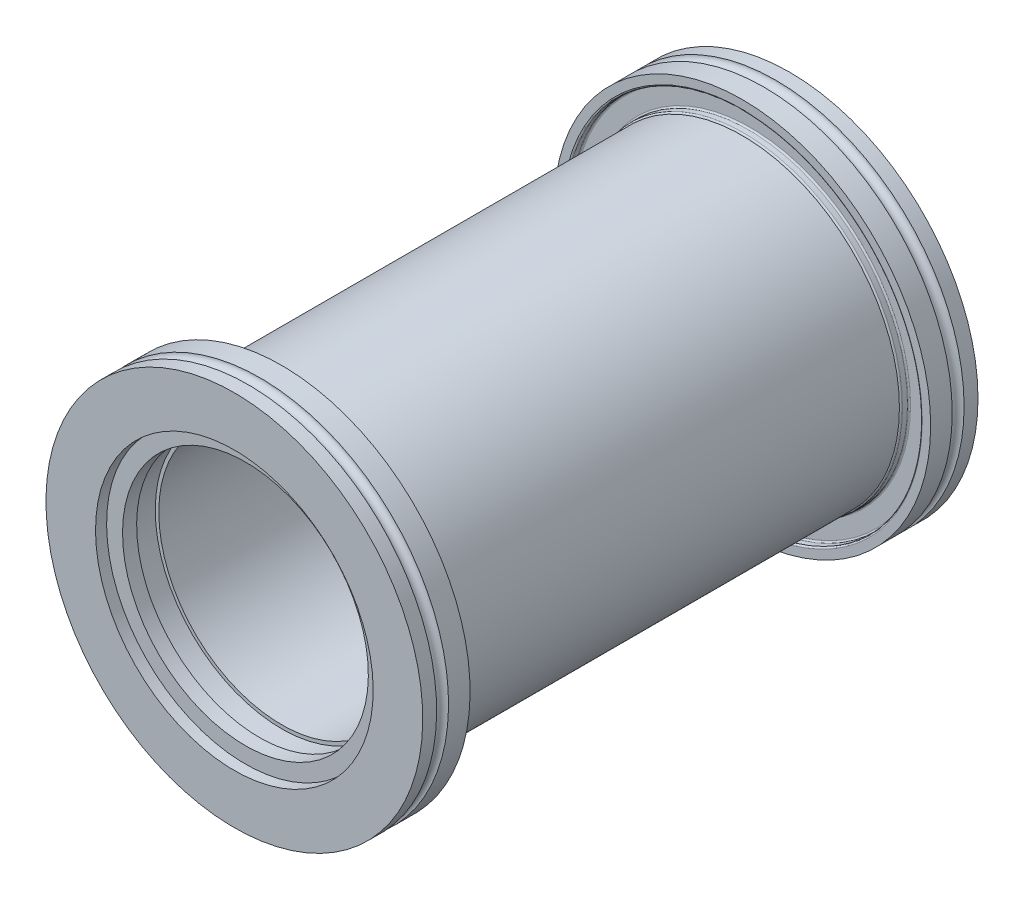
ISO-10303-21;
HEADER;
FILE_DESCRIPTION(('STEP AP214'),'2;1');
FILE_NAME('part.step','',(''),(''),'','','');
FILE_SCHEMA(('AUTOMOTIVE_DESIGN { 1 0 10303 214 1 1 1 1 }'));
ENDSEC;
DATA;
#1=APPLICATION_CONTEXT('core data for automotive mechanical design processes');
#2=APPLICATION_PROTOCOL_DEFINITION('international standard','automotive_design',2000,#1);
#3=PRODUCT_CONTEXT('',#1,'mechanical');
#4=PRODUCT('Part','Part','',(#3));
#5=PRODUCT_RELATED_PRODUCT_CATEGORY('part','',(#4));
#6=PRODUCT_DEFINITION_FORMATION('','',#4);
#7=PRODUCT_DEFINITION_CONTEXT('part definition',#1,'design');
#8=PRODUCT_DEFINITION('design','',#6,#7);
#9=PRODUCT_DEFINITION_SHAPE('','',#8);
#10=(LENGTH_UNIT() NAMED_UNIT(*) SI_UNIT(.MILLI.,.METRE.));
#11=(NAMED_UNIT(*) PLANE_ANGLE_UNIT() SI_UNIT($,.RADIAN.));
#12=(NAMED_UNIT(*) SI_UNIT($,.STERADIAN.) SOLID_ANGLE_UNIT());
#13=UNCERTAINTY_MEASURE_WITH_UNIT(LENGTH_MEASURE(1.E-05),#10,'distance_accuracy_value','');
#14=(GEOMETRIC_REPRESENTATION_CONTEXT(3) GLOBAL_UNCERTAINTY_ASSIGNED_CONTEXT((#13)) GLOBAL_UNIT_ASSIGNED_CONTEXT((#10,
#11,#12)) REPRESENTATION_CONTEXT('',''));
#15=CARTESIAN_POINT('',(0.,0.,0.));
#16=DIRECTION('',(0.,0.,1.));
#17=DIRECTION('',(1.,0.,0.));
#18=AXIS2_PLACEMENT_3D('',#15,#16,#17);
#19=CARTESIAN_POINT('',(-12.0328903200289,15.6558056779659,59.3612689048649));
#20=DIRECTION('',(0.,0.,-1.));
#21=DIRECTION('',(-1.,0.,0.));
#22=AXIS2_PLACEMENT_3D('',#19,#20,#21);
#23=TOROIDAL_SURFACE('',#22,45.3644,0.381);
#24=CARTESIAN_POINT('',(-12.0328903200289,15.6558056779659,59.3612689048649));
#25=DIRECTION('',(0.,0.,1.));
#26=DIRECTION('',(-1.,0.,0.));
#27=AXIS2_PLACEMENT_3D('',#24,#25,#26);
#28=CIRCLE('',#27,44.9834);
#29=CARTESIAN_POINT('',(-57.0162903200289,15.6558056779659,59.3612689048649));
#30=VERTEX_POINT('',#29);
#31=EDGE_CURVE('P0_E11',#30,#30,#28,.T.);
#32=ORIENTED_EDGE('',*,*,#31,.F.);
#33=EDGE_LOOP('',(#32));
#34=FACE_BOUND('',#33,.T.);
#35=CARTESIAN_POINT('',(-12.0328903200289,15.6558056779659,59.7422689048649));
#36=DIRECTION('',(0.,0.,-1.));
#37=DIRECTION('',(-1.,0.,0.));
#38=AXIS2_PLACEMENT_3D('',#35,#36,#37);
#39=CIRCLE('',#38,45.3644);
#40=CARTESIAN_POINT('',(-57.3972903200289,15.6558056779659,59.7422689048649));
#41=VERTEX_POINT('',#40);
#42=EDGE_CURVE('P0_E131',#41,#41,#39,.T.);
#43=ORIENTED_EDGE('',*,*,#42,.F.);
#44=EDGE_LOOP('',(#43));
#45=FACE_BOUND('',#44,.T.);
#46=ADVANCED_FACE('P0_F16',(#34,#45),#23,.T.);
#47=CARTESIAN_POINT('',(-12.0328903200289,15.6558056779659,107.773268904865));
#48=DIRECTION('',(0.,0.,1.));
#49=DIRECTION('',(-1.,0.,0.));
#50=AXIS2_PLACEMENT_3D('',#47,#48,#49);
#51=CYLINDRICAL_SURFACE('',#50,44.9834);
#52=ORIENTED_EDGE('',*,*,#31,.T.);
#53=EDGE_LOOP('',(#52));
#54=FACE_BOUND('',#53,.T.);
#55=CARTESIAN_POINT('',(-12.0328903200289,15.6558056779659,58.0912689048649));
#56=DIRECTION('',(0.,0.,-1.));
#57=DIRECTION('',(1.,0.,0.));
#58=AXIS2_PLACEMENT_3D('',#55,#56,#57);
#59=CIRCLE('',#58,44.9834);
#60=CARTESIAN_POINT('',(32.9505096799711,15.6558056779659,58.0912689048649));
#61=VERTEX_POINT('',#60);
#62=EDGE_CURVE('P0_E128',#61,#61,#59,.T.);
#63=ORIENTED_EDGE('',*,*,#62,.T.);
#64=EDGE_LOOP('',(#63));
#65=FACE_BOUND('',#64,.T.);
#66=ADVANCED_FACE('P0_F18',(#54,#65),#51,.F.);
#67=CARTESIAN_POINT('',(-57.0162903200289,15.6558056779659,57.7102689048649));
#68=DIRECTION('',(0.,0.,1.));
#69=DIRECTION('',(1.,0.,0.));
#70=AXIS2_PLACEMENT_3D('',#67,#68,#69);
#71=PLANE('',#70);
#72=CARTESIAN_POINT('',(-12.0328903200289,15.6558056779659,57.7102689048649));
#73=DIRECTION('',(0.,0.,-1.));
#74=DIRECTION('',(1.,0.,0.));
#75=AXIS2_PLACEMENT_3D('',#72,#73,#74);
#76=CIRCLE('',#75,40.386);
#77=CARTESIAN_POINT('',(28.3531096799711,15.6558056779659,57.7102689048649));
#78=VERTEX_POINT('',#77);
#79=EDGE_CURVE('P0_E27',#78,#78,#76,.T.);
#80=ORIENTED_EDGE('',*,*,#79,.T.);
#81=EDGE_LOOP('',(#80));
#82=FACE_BOUND('',#81,.T.);
#83=CARTESIAN_POINT('',(-12.0328903200289,15.6558056779659,57.7102689048649));
#84=DIRECTION('',(0.,0.,1.));
#85=DIRECTION('',(1.,0.,0.));
#86=AXIS2_PLACEMENT_3D('',#83,#84,#85);
#87=CIRCLE('',#86,44.6024);
#88=CARTESIAN_POINT('',(32.5695096799711,15.6558056779659,57.7102689048649));
#89=VERTEX_POINT('',#88);
#90=EDGE_CURVE('P0_E130',#89,#89,#87,.T.);
#91=ORIENTED_EDGE('',*,*,#90,.T.);
#92=EDGE_LOOP('',(#91));
#93=FACE_BOUND('',#92,.T.);
#94=ADVANCED_FACE('P0_F169',(#82,#93),#71,.T.);
#95=CARTESIAN_POINT('',(-12.0328903200289,15.6558056779659,58.0912689048649));
#96=DIRECTION('',(0.,0.,1.));
#97=DIRECTION('',(1.,0.,0.));
#98=AXIS2_PLACEMENT_3D('',#95,#96,#97);
#99=TOROIDAL_SURFACE('',#98,40.386,0.381);
#100=CARTESIAN_POINT('',(-12.0328903200289,15.6558056779659,58.0912689048649));
#101=DIRECTION('',(0.,0.,1.));
#102=DIRECTION('',(1.,0.,0.));
#103=AXIS2_PLACEMENT_3D('',#100,#101,#102);
#104=CIRCLE('',#103,40.005);
#105=CARTESIAN_POINT('',(27.9721096799711,15.6558056779659,58.0912689048649));
#106=VERTEX_POINT('',#105);
#107=EDGE_CURVE('P0_E137',#106,#106,#104,.T.);
#108=ORIENTED_EDGE('',*,*,#107,.F.);
#109=EDGE_LOOP('',(#108));
#110=FACE_BOUND('',#109,.T.);
#111=ORIENTED_EDGE('',*,*,#79,.F.);
#112=EDGE_LOOP('',(#111));
#113=FACE_BOUND('',#112,.T.);
#114=ADVANCED_FACE('P0_F166',(#110,#113),#99,.F.);
#115=CARTESIAN_POINT('',(-12.0328903200289,15.6558056779659,107.773268904865));
#116=DIRECTION('',(0.,0.,1.));
#117=DIRECTION('',(-1.,0.,0.));
#118=AXIS2_PLACEMENT_3D('',#115,#116,#117);
#119=CYLINDRICAL_SURFACE('',#118,40.005);
#120=CARTESIAN_POINT('',(-12.0328903200289,15.6558056779659,59.3612689048649));
#121=DIRECTION('',(0.,0.,-1.));
#122=DIRECTION('',(-1.,0.,0.));
#123=AXIS2_PLACEMENT_3D('',#120,#121,#122);
#124=CIRCLE('',#123,40.005);
#125=CARTESIAN_POINT('',(-52.0378903200289,15.6558056779659,59.3612689048649));
#126=VERTEX_POINT('',#125);
#127=EDGE_CURVE('P0_E93',#126,#126,#124,.T.);
#128=ORIENTED_EDGE('',*,*,#127,.T.);
#129=EDGE_LOOP('',(#128));
#130=FACE_BOUND('',#129,.T.);
#131=ORIENTED_EDGE('',*,*,#107,.T.);
#132=EDGE_LOOP('',(#131));
#133=FACE_BOUND('',#132,.T.);
#134=ADVANCED_FACE('P0_F164',(#130,#133),#119,.T.);
#135=CARTESIAN_POINT('',(-12.0328903200289,15.6558056779659,58.0912689048649));
#136=DIRECTION('',(0.,0.,1.));
#137=DIRECTION('',(1.,0.,0.));
#138=AXIS2_PLACEMENT_3D('',#135,#136,#137);
#139=TOROIDAL_SURFACE('',#138,44.6024,0.381);
#140=ORIENTED_EDGE('',*,*,#90,.F.);
#141=EDGE_LOOP('',(#140));
#142=FACE_BOUND('',#141,.T.);
#143=ORIENTED_EDGE('',*,*,#62,.F.);
#144=EDGE_LOOP('',(#143));
#145=FACE_BOUND('',#144,.T.);
#146=ADVANCED_FACE('P0_F178',(#142,#145),#139,.F.);
#147=CARTESIAN_POINT('',(-12.0328903200289,15.6558056779659,52.8080689048649));
#148=DIRECTION('',(0.,0.,-1.));
#149=DIRECTION('',(-1.,0.,0.));
#150=AXIS2_PLACEMENT_3D('',#147,#148,#149);
#151=TOROIDAL_SURFACE('',#150,47.498,1.4986);
#152=CARTESIAN_POINT('',(-12.0328903200289,15.6558056779659,51.3094689048649));
#153=DIRECTION('',(0.,0.,1.));
#154=DIRECTION('',(1.,0.,0.));
#155=AXIS2_PLACEMENT_3D('',#152,#153,#154);
#156=CIRCLE('',#155,47.498);
#157=CARTESIAN_POINT('',(35.4651096799711,15.6558056779659,51.3094689048649));
#158=VERTEX_POINT('',#157);
#159=EDGE_CURVE('P0_E100',#158,#158,#156,.T.);
#160=ORIENTED_EDGE('',*,*,#159,.T.);
#161=EDGE_LOOP('',(#160));
#162=FACE_BOUND('',#161,.T.);
#163=CARTESIAN_POINT('',(-12.0328903200289,15.6558056779659,54.3066689048649));
#164=DIRECTION('',(0.,0.,-1.));
#165=DIRECTION('',(-1.,0.,0.));
#166=AXIS2_PLACEMENT_3D('',#163,#164,#165);
#167=CIRCLE('',#166,47.498);
#168=CARTESIAN_POINT('',(-59.5308903200289,15.6558056779659,54.3066689048649));
#169=VERTEX_POINT('',#168);
#170=EDGE_CURVE('P0_E141',#169,#169,#167,.T.);
#171=ORIENTED_EDGE('',*,*,#170,.T.);
#172=EDGE_LOOP('',(#171));
#173=FACE_BOUND('',#172,.T.);
#174=ADVANCED_FACE('P0_F181',(#162,#173),#151,.F.);
#175=CARTESIAN_POINT('',(-12.0328903200289,15.6558056779659,47.8042689048649));
#176=DIRECTION('',(0.,0.,-1.));
#177=DIRECTION('',(0.,-1.,0.));
#178=AXIS2_PLACEMENT_3D('',#175,#176,#177);
#179=PLANE('',#178);
#180=CARTESIAN_POINT('',(-12.0328903200289,15.6558056779659,47.8042689048649));
#181=DIRECTION('',(0.,0.,1.));
#182=DIRECTION('',(-1.,0.,0.));
#183=AXIS2_PLACEMENT_3D('',#180,#181,#182);
#184=CIRCLE('',#183,35.0012);
#185=CARTESIAN_POINT('',(-47.0340903200289,15.6558056779659,47.8042689048649));
#186=VERTEX_POINT('',#185);
#187=EDGE_CURVE('P0_E60',#186,#186,#184,.T.);
#188=ORIENTED_EDGE('',*,*,#187,.T.);
#189=EDGE_LOOP('',(#188));
#190=FACE_BOUND('',#189,.T.);
#191=CARTESIAN_POINT('',(-12.0328903200289,15.6558056779659,47.8042689048649));
#192=DIRECTION('',(0.,0.,-1.));
#193=DIRECTION('',(1.,0.,0.));
#194=AXIS2_PLACEMENT_3D('',#191,#192,#193);
#195=CIRCLE('',#194,47.498);
#196=CARTESIAN_POINT('',(35.4651096799711,15.6558056779659,47.8042689048649));
#197=VERTEX_POINT('',#196);
#198=EDGE_CURVE('P0_E108',#197,#197,#195,.T.);
#199=ORIENTED_EDGE('',*,*,#198,.T.);
#200=EDGE_LOOP('',(#199));
#201=FACE_BOUND('',#200,.T.);
#202=ADVANCED_FACE('P0_F109',(#190,#201),#179,.T.);
#203=CARTESIAN_POINT('',(-12.0328903200289,15.6558056779659,59.7422689048649));
#204=DIRECTION('',(0.,0.,-1.));
#205=DIRECTION('',(0.,-1.,0.));
#206=AXIS2_PLACEMENT_3D('',#203,#204,#205);
#207=PLANE('',#206);
#208=ORIENTED_EDGE('',*,*,#42,.T.);
#209=EDGE_LOOP('',(#208));
#210=FACE_BOUND('',#209,.T.);
#211=CARTESIAN_POINT('',(-12.0328903200289,15.6558056779659,59.7422689048649));
#212=DIRECTION('',(0.,0.,-1.));
#213=DIRECTION('',(1.,0.,0.));
#214=AXIS2_PLACEMENT_3D('',#211,#212,#213);
#215=CIRCLE('',#214,47.498);
#216=CARTESIAN_POINT('',(35.4651096799711,15.6558056779659,59.7422689048649));
#217=VERTEX_POINT('',#216);
#218=EDGE_CURVE('P0_E149',#217,#217,#215,.T.);
#219=ORIENTED_EDGE('',*,*,#218,.F.);
#220=EDGE_LOOP('',(#219));
#221=FACE_BOUND('',#220,.T.);
#222=ADVANCED_FACE('P0_F237',(#210,#221),#207,.F.);
#223=CARTESIAN_POINT('',(-12.0328903200289,15.6558056779659,59.7422689048649));
#224=DIRECTION('',(0.,0.,1.));
#225=DIRECTION('',(-1.,0.,0.));
#226=AXIS2_PLACEMENT_3D('',#223,#224,#225);
#227=CYLINDRICAL_SURFACE('',#226,47.498);
#228=ORIENTED_EDGE('',*,*,#170,.F.);
#229=EDGE_LOOP('',(#228));
#230=FACE_BOUND('',#229,.T.);
#231=ORIENTED_EDGE('',*,*,#218,.T.);
#232=EDGE_LOOP('',(#231));
#233=FACE_BOUND('',#232,.T.);
#234=ADVANCED_FACE('P0_F227',(#230,#233),#227,.T.);
#235=CARTESIAN_POINT('',(-12.0328903200289,15.6558056779659,50.5982689048649));
#236=DIRECTION('',(0.,0.,1.));
#237=DIRECTION('',(1.,0.,0.));
#238=AXIS2_PLACEMENT_3D('',#235,#236,#237);
#239=PLANE('',#238);
#240=CARTESIAN_POINT('',(-12.0328903200289,15.6558056779659,50.5982689048649));
#241=DIRECTION('',(0.,0.,-1.));
#242=DIRECTION('',(1.,0.,0.));
#243=AXIS2_PLACEMENT_3D('',#240,#241,#242);
#244=CIRCLE('',#243,30.988);
#245=CARTESIAN_POINT('',(18.9551096799711,15.6558056779659,50.5982689048649));
#246=VERTEX_POINT('',#245);
#247=EDGE_CURVE('P0_E155',#246,#246,#244,.T.);
#248=ORIENTED_EDGE('',*,*,#247,.F.);
#249=EDGE_LOOP('',(#248));
#250=FACE_BOUND('',#249,.T.);
#251=CARTESIAN_POINT('',(-12.0328903200289,15.6558056779659,50.5982689048649));
#252=DIRECTION('',(0.,0.,1.));
#253=DIRECTION('',(-1.,0.,0.));
#254=AXIS2_PLACEMENT_3D('',#251,#252,#253);
#255=CIRCLE('',#254,35.0012);
#256=CARTESIAN_POINT('',(-47.0340903200289,15.6558056779659,50.5982689048649));
#257=VERTEX_POINT('',#256);
#258=EDGE_CURVE('P0_E154',#257,#257,#255,.T.);
#259=ORIENTED_EDGE('',*,*,#258,.F.);
#260=EDGE_LOOP('',(#259));
#261=FACE_BOUND('',#260,.T.);
#262=ADVANCED_FACE('P0_F232',(#250,#261),#239,.F.);
#263=CARTESIAN_POINT('',(-12.0328903200289,15.6558056779659,188.647268904865));
#264=DIRECTION('',(0.,0.,1.));
#265=DIRECTION('',(-1.,0.,0.));
#266=AXIS2_PLACEMENT_3D('',#263,#264,#265);
#267=CYLINDRICAL_SURFACE('',#266,30.988);
#268=CARTESIAN_POINT('',(-12.0328903200289,15.6558056779659,54.1542689048649));
#269=DIRECTION('',(0.,0.,1.));
#270=DIRECTION('',(-1.,0.,0.));
#271=AXIS2_PLACEMENT_3D('',#268,#269,#270);
#272=CIRCLE('',#271,30.988);
#273=CARTESIAN_POINT('',(-43.0208903200289,15.6558056779659,54.1542689048649));
#274=VERTEX_POINT('',#273);
#275=EDGE_CURVE('P0_E70',#274,#274,#272,.T.);
#276=ORIENTED_EDGE('',*,*,#275,.T.);
#277=EDGE_LOOP('',(#276));
#278=FACE_BOUND('',#277,.T.);
#279=ORIENTED_EDGE('',*,*,#247,.T.);
#280=EDGE_LOOP('',(#279));
#281=FACE_BOUND('',#280,.T.);
#282=ADVANCED_FACE('P0_F202',(#278,#281),#267,.F.);
#283=CARTESIAN_POINT('',(-12.0328903200289,15.6558056779659,50.5982689048649));
#284=DIRECTION('',(0.,0.,1.));
#285=DIRECTION('',(-1.,0.,0.));
#286=AXIS2_PLACEMENT_3D('',#283,#284,#285);
#287=CYLINDRICAL_SURFACE('',#286,35.0012);
#288=ORIENTED_EDGE('',*,*,#258,.T.);
#289=EDGE_LOOP('',(#288));
#290=FACE_BOUND('',#289,.T.);
#291=ORIENTED_EDGE('',*,*,#187,.F.);
#292=EDGE_LOOP('',(#291));
#293=FACE_BOUND('',#292,.T.);
#294=ADVANCED_FACE('P0_F199',(#290,#293),#287,.F.);
#295=CARTESIAN_POINT('',(-12.0328903200289,15.6558056779659,54.1542689048649));
#296=DIRECTION('',(0.,0.,-1.));
#297=DIRECTION('',(0.,-1.,0.));
#298=AXIS2_PLACEMENT_3D('',#295,#296,#297);
#299=PLANE('',#298);
#300=ORIENTED_EDGE('',*,*,#275,.F.);
#301=EDGE_LOOP('',(#300));
#302=FACE_BOUND('',#301,.T.);
#303=CARTESIAN_POINT('',(-12.0328903200289,15.6558056779659,54.1542689048649));
#304=DIRECTION('',(0.,0.,-1.));
#305=DIRECTION('',(1.,0.,0.));
#306=AXIS2_PLACEMENT_3D('',#303,#304,#305);
#307=CIRCLE('',#306,31.877);
#308=CARTESIAN_POINT('',(19.8441096799711,15.6558056779659,54.1542689048649));
#309=VERTEX_POINT('',#308);
#310=EDGE_CURVE('P0_E125',#309,#309,#307,.T.);
#311=ORIENTED_EDGE('',*,*,#310,.F.);
#312=EDGE_LOOP('',(#311));
#313=FACE_BOUND('',#312,.T.);
#314=ADVANCED_FACE('P0_F201',(#302,#313),#299,.F.);
#315=CARTESIAN_POINT('',(-12.0328903200289,15.6558056779659,54.1542689048649));
#316=DIRECTION('',(0.,0.,-1.));
#317=DIRECTION('',(1.,0.,0.));
#318=AXIS2_PLACEMENT_3D('',#315,#316,#317);
#319=CYLINDRICAL_SURFACE('',#318,31.877);
#320=ORIENTED_EDGE('',*,*,#310,.T.);
#321=EDGE_LOOP('',(#320));
#322=FACE_BOUND('',#321,.T.);
#323=CARTESIAN_POINT('',(-12.0328903200289,15.6558056779659,59.7422689048649));
#324=DIRECTION('',(0.,0.,-1.));
#325=DIRECTION('',(1.,0.,0.));
#326=AXIS2_PLACEMENT_3D('',#323,#324,#325);
#327=CIRCLE('',#326,31.877);
#328=CARTESIAN_POINT('',(19.8441096799711,15.6558056779659,59.7422689048649));
#329=VERTEX_POINT('',#328);
#330=EDGE_CURVE('P0_E127',#329,#329,#327,.T.);
#331=ORIENTED_EDGE('',*,*,#330,.F.);
#332=EDGE_LOOP('',(#331));
#333=FACE_BOUND('',#332,.T.);
#334=ADVANCED_FACE('P0_F216',(#322,#333),#319,.F.);
#335=CARTESIAN_POINT('',(-12.0328903200289,15.6558056779659,59.3612689048649));
#336=DIRECTION('',(0.,0.,-1.));
#337=DIRECTION('',(-1.,0.,0.));
#338=AXIS2_PLACEMENT_3D('',#335,#336,#337);
#339=TOROIDAL_SURFACE('',#338,39.624,0.381);
#340=CARTESIAN_POINT('',(-12.0328903200289,15.6558056779659,59.7422689048649));
#341=DIRECTION('',(0.,0.,1.));
#342=DIRECTION('',(-1.,0.,0.));
#343=AXIS2_PLACEMENT_3D('',#340,#341,#342);
#344=CIRCLE('',#343,39.624);
#345=CARTESIAN_POINT('',(-51.6568903200289,15.6558056779659,59.7422689048649));
#346=VERTEX_POINT('',#345);
#347=EDGE_CURVE('P0_E20',#346,#346,#344,.T.);
#348=ORIENTED_EDGE('',*,*,#347,.F.);
#349=EDGE_LOOP('',(#348));
#350=FACE_BOUND('',#349,.T.);
#351=ORIENTED_EDGE('',*,*,#127,.F.);
#352=EDGE_LOOP('',(#351));
#353=FACE_BOUND('',#352,.T.);
#354=ADVANCED_FACE('P0_F207',(#350,#353),#339,.T.);
#355=CARTESIAN_POINT('',(-12.0328903200289,15.6558056779659,59.7422689048649));
#356=DIRECTION('',(0.,0.,1.));
#357=DIRECTION('',(-1.,0.,0.));
#358=AXIS2_PLACEMENT_3D('',#355,#356,#357);
#359=CYLINDRICAL_SURFACE('',#358,47.498);
#360=ORIENTED_EDGE('',*,*,#159,.F.);
#361=EDGE_LOOP('',(#360));
#362=FACE_BOUND('',#361,.T.);
#363=ORIENTED_EDGE('',*,*,#198,.F.);
#364=EDGE_LOOP('',(#363));
#365=FACE_BOUND('',#364,.T.);
#366=ADVANCED_FACE('P0_F204',(#362,#365),#359,.T.);
#367=CARTESIAN_POINT('',(-12.0328903200289,15.6558056779659,59.7422689048649));
#368=DIRECTION('',(0.,0.,-1.));
#369=DIRECTION('',(-1.,0.,0.));
#370=AXIS2_PLACEMENT_3D('',#367,#368,#369);
#371=PLANE('',#370);
#372=CARTESIAN_POINT('',(-12.0328903200289,15.6558056779659,59.7422689048649));
#373=DIRECTION('',(0.,0.,-1.));
#374=DIRECTION('',(-1.,0.,0.));
#375=AXIS2_PLACEMENT_3D('',#372,#373,#374);
#376=CIRCLE('',#375,30.988);
#377=CARTESIAN_POINT('',(-43.0208903200289,15.6558056779659,59.7422689048649));
#378=VERTEX_POINT('',#377);
#379=EDGE_CURVE('P0_E261',#378,#378,#376,.T.);
#380=ORIENTED_EDGE('',*,*,#379,.F.);
#381=EDGE_LOOP('',(#380));
#382=FACE_BOUND('',#381,.T.);
#383=ORIENTED_EDGE('',*,*,#330,.T.);
#384=EDGE_LOOP('',(#383));
#385=FACE_BOUND('',#384,.T.);
#386=ADVANCED_FACE('P0_F206',(#382,#385),#371,.T.);
#387=CARTESIAN_POINT('',(-12.0328903200289,15.6558056779659,175.862268904865));
#388=DIRECTION('',(0.,0.,-1.));
#389=DIRECTION('',(-1.,0.,0.));
#390=AXIS2_PLACEMENT_3D('',#387,#388,#389);
#391=CYLINDRICAL_SURFACE('',#390,39.624);
#392=CARTESIAN_POINT('',(-12.0328903200289,15.6558056779659,175.862268904865));
#393=DIRECTION('',(0.,0.,-1.));
#394=DIRECTION('',(-1.,0.,0.));
#395=AXIS2_PLACEMENT_3D('',#392,#393,#394);
#396=CIRCLE('',#395,39.624);
#397=CARTESIAN_POINT('',(-51.6568903200289,15.6558056779659,175.862268904865));
#398=VERTEX_POINT('',#397);
#399=EDGE_CURVE('P0_E112',#398,#398,#396,.T.);
#400=CARTESIAN_POINT('',(-51.6568903200289,15.6558056779659,175.862268904865));
#401=CARTESIAN_POINT('',(-51.6568903200289,15.6558056779659,174.652685571532));
#402=CARTESIAN_POINT('',(-51.6568903200289,15.6558056779659,173.443102238198));
#403=CARTESIAN_POINT('',(-51.6568903200289,15.6558056779659,171.023935571532));
#404=CARTESIAN_POINT('',(-51.6568903200289,15.6558056779659,169.814352238198));
#405=CARTESIAN_POINT('',(-51.6568903200289,15.6558056779659,167.395185571532));
#406=CARTESIAN_POINT('',(-51.6568903200289,15.6558056779659,166.185602238198));
#407=CARTESIAN_POINT('',(-51.6568903200289,15.6558056779659,163.766435571532));
#408=CARTESIAN_POINT('',(-51.6568903200289,15.6558056779659,162.556852238198));
#409=CARTESIAN_POINT('',(-51.6568903200289,15.6558056779659,160.137685571532));
#410=CARTESIAN_POINT('',(-51.6568903200289,15.6558056779659,158.928102238198));
#411=CARTESIAN_POINT('',(-51.6568903200289,15.6558056779659,156.508935571532));
#412=CARTESIAN_POINT('',(-51.6568903200289,15.6558056779659,155.299352238198));
#413=CARTESIAN_POINT('',(-51.6568903200289,15.6558056779659,152.880185571532));
#414=CARTESIAN_POINT('',(-51.6568903200289,15.6558056779659,151.670602238198));
#415=CARTESIAN_POINT('',(-51.6568903200289,15.6558056779659,149.251435571532));
#416=CARTESIAN_POINT('',(-51.6568903200289,15.6558056779659,148.041852238198));
#417=CARTESIAN_POINT('',(-51.6568903200289,15.6558056779659,145.622685571532));
#418=CARTESIAN_POINT('',(-51.6568903200289,15.6558056779659,144.413102238198));
#419=CARTESIAN_POINT('',(-51.6568903200289,15.6558056779659,141.993935571532));
#420=CARTESIAN_POINT('',(-51.6568903200289,15.6558056779659,140.784352238198));
#421=CARTESIAN_POINT('',(-51.6568903200289,15.6558056779659,138.365185571532));
#422=CARTESIAN_POINT('',(-51.6568903200289,15.6558056779659,137.155602238198));
#423=CARTESIAN_POINT('',(-51.6568903200289,15.6558056779659,134.736435571532));
#424=CARTESIAN_POINT('',(-51.6568903200289,15.6558056779659,133.526852238198));
#425=CARTESIAN_POINT('',(-51.6568903200289,15.6558056779659,131.107685571532));
#426=CARTESIAN_POINT('',(-51.6568903200289,15.6558056779659,129.898102238198));
#427=CARTESIAN_POINT('',(-51.6568903200289,15.6558056779659,127.478935571532));
#428=CARTESIAN_POINT('',(-51.6568903200289,15.6558056779659,126.269352238198));
#429=CARTESIAN_POINT('',(-51.6568903200289,15.6558056779659,123.850185571532));
#430=CARTESIAN_POINT('',(-51.6568903200289,15.6558056779659,122.640602238198));
#431=CARTESIAN_POINT('',(-51.6568903200289,15.6558056779659,120.221435571532));
#432=CARTESIAN_POINT('',(-51.6568903200289,15.6558056779659,119.011852238198));
#433=CARTESIAN_POINT('',(-51.6568903200289,15.6558056779659,116.592685571532));
#434=CARTESIAN_POINT('',(-51.6568903200289,15.6558056779659,115.383102238198));
#435=CARTESIAN_POINT('',(-51.6568903200289,15.6558056779659,112.963935571532));
#436=CARTESIAN_POINT('',(-51.6568903200289,15.6558056779659,111.754352238198));
#437=CARTESIAN_POINT('',(-51.6568903200289,15.6558056779659,109.335185571532));
#438=CARTESIAN_POINT('',(-51.6568903200289,15.6558056779659,108.125602238198));
#439=CARTESIAN_POINT('',(-51.6568903200289,15.6558056779659,105.706435571532));
#440=CARTESIAN_POINT('',(-51.6568903200289,15.6558056779659,104.496852238198));
#441=CARTESIAN_POINT('',(-51.6568903200289,15.6558056779659,102.077685571532));
#442=CARTESIAN_POINT('',(-51.6568903200289,15.6558056779659,100.868102238198));
#443=CARTESIAN_POINT('',(-51.6568903200289,15.6558056779659,98.4489355715316));
#444=CARTESIAN_POINT('',(-51.6568903200289,15.6558056779659,97.2393522381982));
#445=CARTESIAN_POINT('',(-51.6568903200289,15.6558056779659,94.8201855715316));
#446=CARTESIAN_POINT('',(-51.6568903200289,15.6558056779659,93.6106022381982));
#447=CARTESIAN_POINT('',(-51.6568903200289,15.6558056779659,91.1914355715316));
#448=CARTESIAN_POINT('',(-51.6568903200289,15.6558056779659,89.9818522381982));
#449=CARTESIAN_POINT('',(-51.6568903200289,15.6558056779659,87.5626855715316));
#450=CARTESIAN_POINT('',(-51.6568903200289,15.6558056779659,86.3531022381982));
#451=CARTESIAN_POINT('',(-51.6568903200289,15.6558056779659,83.9339355715316));
#452=CARTESIAN_POINT('',(-51.6568903200289,15.6558056779659,82.7243522381982));
#453=CARTESIAN_POINT('',(-51.6568903200289,15.6558056779659,80.3051855715316));
#454=CARTESIAN_POINT('',(-51.6568903200289,15.6558056779659,79.0956022381982));
#455=CARTESIAN_POINT('',(-51.6568903200289,15.6558056779659,76.6764355715315));
#456=CARTESIAN_POINT('',(-51.6568903200289,15.6558056779659,75.4668522381982));
#457=CARTESIAN_POINT('',(-51.6568903200289,15.6558056779659,73.0476855715315));
#458=CARTESIAN_POINT('',(-51.6568903200289,15.6558056779659,71.8381022381982));
#459=CARTESIAN_POINT('',(-51.6568903200289,15.6558056779659,69.4189355715315));
#460=CARTESIAN_POINT('',(-51.6568903200289,15.6558056779659,68.2093522381982));
#461=CARTESIAN_POINT('',(-51.6568903200289,15.6558056779659,65.7901855715316));
#462=CARTESIAN_POINT('',(-51.6568903200289,15.6558056779659,64.5806022381982));
#463=CARTESIAN_POINT('',(-51.6568903200289,15.6558056779659,62.1614355715315));
#464=CARTESIAN_POINT('',(-51.6568903200289,15.6558056779659,60.9518522381982));
#465=CARTESIAN_POINT('',(-51.6568903200289,15.6558056779659,59.7422689048649));
#466=B_SPLINE_CURVE_WITH_KNOTS('',3,(#400,#401,#402,#403,#404,#405,#406,#407,#408,#409,#410,
#411,#412,#413,#414,#415,#416,#417,#418,#419,#420,#421,#422,#423,#424,#425,#426,#427,#428,#429,
#430,#431,#432,#433,#434,#435,#436,#437,#438,#439,#440,#441,#442,#443,#444,#445,#446,#447,#448,
#449,#450,#451,#452,#453,#454,#455,#456,#457,#458,#459,#460,#461,#462,#463,#464,#465),
.UNSPECIFIED.,.F.,.F.,(4,2,2,2,2,2,2,2,2,2,2,2,2,2,2,2,2,2,2,2,2,2,2,2,2,2,2,2,2,2,2,2,4),(0.,
3.62874999999999,7.2575,10.88625,14.515,18.14375,21.7725,25.40125,29.03,32.65875,36.2875,
39.91625,43.545,47.17375,50.8025,54.43125,58.06,61.68875,65.3175,68.94625,72.575,76.20375,
79.8325,83.46125,87.09,90.71875,94.3475,97.97625,101.605,105.23375,108.8625,112.49125,116.12),.UNSPECIFIED.);
#467=EDGE_CURVE('P0_BSEAM213',#398,#346,#466,.T.);
#468=ORIENTED_EDGE('',*,*,#399,.T.);
#469=ORIENTED_EDGE('',*,*,#347,.T.);
#470=ORIENTED_EDGE('',*,*,#467,.T.);
#471=ORIENTED_EDGE('',*,*,#467,.F.);
#472=EDGE_LOOP('',(#468,#470,#469,#471));
#473=FACE_BOUND('',#472,.T.);
#474=ADVANCED_FACE('P0_F213',(#473),#391,.T.);
#475=CARTESIAN_POINT('',(-12.0328903200289,15.6558056779659,175.862268904865));
#476=DIRECTION('',(0.,0.,-1.));
#477=DIRECTION('',(-1.,0.,0.));
#478=AXIS2_PLACEMENT_3D('',#475,#476,#477);
#479=PLANE('',#478);
#480=CARTESIAN_POINT('',(-12.0328903200289,15.6558056779659,175.862268904865));
#481=DIRECTION('',(0.,0.,-1.));
#482=DIRECTION('',(-1.,0.,0.));
#483=AXIS2_PLACEMENT_3D('',#480,#481,#482);
#484=CIRCLE('',#483,30.988);
#485=CARTESIAN_POINT('',(-43.0208903200289,15.6558056779659,175.862268904865));
#486=VERTEX_POINT('',#485);
#487=EDGE_CURVE('P0_E120',#486,#486,#484,.T.);
#488=ORIENTED_EDGE('',*,*,#487,.T.);
#489=EDGE_LOOP('',(#488));
#490=FACE_BOUND('',#489,.T.);
#491=ORIENTED_EDGE('',*,*,#399,.F.);
#492=EDGE_LOOP('',(#491));
#493=FACE_BOUND('',#492,.T.);
#494=ADVANCED_FACE('P0_F267',(#490,#493),#479,.F.);
#495=CARTESIAN_POINT('',(-12.0328903200289,15.6558056779659,175.862268904865));
#496=DIRECTION('',(0.,0.,-1.));
#497=DIRECTION('',(-1.,0.,0.));
#498=AXIS2_PLACEMENT_3D('',#495,#496,#497);
#499=CYLINDRICAL_SURFACE('',#498,30.988);
#500=CARTESIAN_POINT('',(-43.0208903200289,15.6558056779659,175.862268904865));
#501=CARTESIAN_POINT('',(-43.0208903200289,15.6558056779659,174.652685571532));
#502=CARTESIAN_POINT('',(-43.0208903200289,15.6558056779659,173.443102238198));
#503=CARTESIAN_POINT('',(-43.0208903200289,15.6558056779659,171.023935571532));
#504=CARTESIAN_POINT('',(-43.0208903200289,15.6558056779659,169.814352238198));
#505=CARTESIAN_POINT('',(-43.0208903200289,15.6558056779659,167.395185571532));
#506=CARTESIAN_POINT('',(-43.0208903200289,15.6558056779659,166.185602238198));
#507=CARTESIAN_POINT('',(-43.0208903200289,15.6558056779659,163.766435571532));
#508=CARTESIAN_POINT('',(-43.0208903200289,15.6558056779659,162.556852238198));
#509=CARTESIAN_POINT('',(-43.0208903200289,15.6558056779659,160.137685571532));
#510=CARTESIAN_POINT('',(-43.0208903200289,15.6558056779659,158.928102238198));
#511=CARTESIAN_POINT('',(-43.0208903200289,15.6558056779659,156.508935571532));
#512=CARTESIAN_POINT('',(-43.0208903200289,15.6558056779659,155.299352238198));
#513=CARTESIAN_POINT('',(-43.0208903200289,15.6558056779659,152.880185571532));
#514=CARTESIAN_POINT('',(-43.0208903200289,15.6558056779659,151.670602238198));
#515=CARTESIAN_POINT('',(-43.0208903200289,15.6558056779659,149.251435571532));
#516=CARTESIAN_POINT('',(-43.0208903200289,15.6558056779659,148.041852238198));
#517=CARTESIAN_POINT('',(-43.0208903200289,15.6558056779659,145.622685571532));
#518=CARTESIAN_POINT('',(-43.0208903200289,15.6558056779659,144.413102238198));
#519=CARTESIAN_POINT('',(-43.0208903200289,15.6558056779659,141.993935571532));
#520=CARTESIAN_POINT('',(-43.0208903200289,15.6558056779659,140.784352238198));
#521=CARTESIAN_POINT('',(-43.0208903200289,15.6558056779659,138.365185571532));
#522=CARTESIAN_POINT('',(-43.0208903200289,15.6558056779659,137.155602238198));
#523=CARTESIAN_POINT('',(-43.0208903200289,15.6558056779659,134.736435571532));
#524=CARTESIAN_POINT('',(-43.0208903200289,15.6558056779659,133.526852238198));
#525=CARTESIAN_POINT('',(-43.0208903200289,15.6558056779659,131.107685571532));
#526=CARTESIAN_POINT('',(-43.0208903200289,15.6558056779659,129.898102238198));
#527=CARTESIAN_POINT('',(-43.0208903200289,15.6558056779659,127.478935571532));
#528=CARTESIAN_POINT('',(-43.0208903200289,15.6558056779659,126.269352238198));
#529=CARTESIAN_POINT('',(-43.0208903200289,15.6558056779659,123.850185571532));
#530=CARTESIAN_POINT('',(-43.0208903200289,15.6558056779659,122.640602238198));
#531=CARTESIAN_POINT('',(-43.0208903200289,15.6558056779659,120.221435571532));
#532=CARTESIAN_POINT('',(-43.0208903200289,15.6558056779659,119.011852238198));
#533=CARTESIAN_POINT('',(-43.0208903200289,15.6558056779659,116.592685571532));
#534=CARTESIAN_POINT('',(-43.0208903200289,15.6558056779659,115.383102238198));
#535=CARTESIAN_POINT('',(-43.0208903200289,15.6558056779659,112.963935571532));
#536=CARTESIAN_POINT('',(-43.0208903200289,15.6558056779659,111.754352238198));
#537=CARTESIAN_POINT('',(-43.0208903200289,15.6558056779659,109.335185571532));
#538=CARTESIAN_POINT('',(-43.0208903200289,15.6558056779659,108.125602238198));
#539=CARTESIAN_POINT('',(-43.0208903200289,15.6558056779659,105.706435571532));
#540=CARTESIAN_POINT('',(-43.0208903200289,15.6558056779659,104.496852238198));
#541=CARTESIAN_POINT('',(-43.0208903200289,15.6558056779659,102.077685571532));
#542=CARTESIAN_POINT('',(-43.0208903200289,15.6558056779659,100.868102238198));
#543=CARTESIAN_POINT('',(-43.0208903200289,15.6558056779659,98.4489355715316));
#544=CARTESIAN_POINT('',(-43.0208903200289,15.6558056779659,97.2393522381982));
#545=CARTESIAN_POINT('',(-43.0208903200289,15.6558056779659,94.8201855715316));
#546=CARTESIAN_POINT('',(-43.0208903200289,15.6558056779659,93.6106022381982));
#547=CARTESIAN_POINT('',(-43.0208903200289,15.6558056779659,91.1914355715316));
#548=CARTESIAN_POINT('',(-43.0208903200289,15.6558056779659,89.9818522381982));
#549=CARTESIAN_POINT('',(-43.0208903200289,15.6558056779659,87.5626855715316));
#550=CARTESIAN_POINT('',(-43.0208903200289,15.6558056779659,86.3531022381982));
#551=CARTESIAN_POINT('',(-43.0208903200289,15.6558056779659,83.9339355715316));
#552=CARTESIAN_POINT('',(-43.0208903200289,15.6558056779659,82.7243522381982));
#553=CARTESIAN_POINT('',(-43.0208903200289,15.6558056779659,80.3051855715316));
#554=CARTESIAN_POINT('',(-43.0208903200289,15.6558056779659,79.0956022381982));
#555=CARTESIAN_POINT('',(-43.0208903200289,15.6558056779659,76.6764355715316));
#556=CARTESIAN_POINT('',(-43.0208903200289,15.6558056779659,75.4668522381982));
#557=CARTESIAN_POINT('',(-43.0208903200289,15.6558056779659,73.0476855715316));
#558=CARTESIAN_POINT('',(-43.0208903200289,15.6558056779659,71.8381022381982));
#559=CARTESIAN_POINT('',(-43.0208903200289,15.6558056779659,69.4189355715316));
#560=CARTESIAN_POINT('',(-43.0208903200289,15.6558056779659,68.2093522381982));
#561=CARTESIAN_POINT('',(-43.0208903200289,15.6558056779659,65.7901855715316));
#562=CARTESIAN_POINT('',(-43.0208903200289,15.6558056779659,64.5806022381982));
#563=CARTESIAN_POINT('',(-43.0208903200289,15.6558056779659,62.1614355715316));
#564=CARTESIAN_POINT('',(-43.0208903200289,15.6558056779659,60.9518522381982));
#565=CARTESIAN_POINT('',(-43.0208903200289,15.6558056779659,59.7422689048649));
#566=B_SPLINE_CURVE_WITH_KNOTS('',3,(#500,#501,#502,#503,#504,#505,#506,#507,#508,#509,#510,
#511,#512,#513,#514,#515,#516,#517,#518,#519,#520,#521,#522,#523,#524,#525,#526,#527,#528,#529,
#530,#531,#532,#533,#534,#535,#536,#537,#538,#539,#540,#541,#542,#543,#544,#545,#546,#547,#548,
#549,#550,#551,#552,#553,#554,#555,#556,#557,#558,#559,#560,#561,#562,#563,#564,#565),
.UNSPECIFIED.,.F.,.F.,(4,2,2,2,2,2,2,2,2,2,2,2,2,2,2,2,2,2,2,2,2,2,2,2,2,2,2,2,2,2,2,2,4),(0.,
3.62874999999999,7.25749999999997,10.88625,14.515,18.14375,21.7725,25.40125,29.03,32.65875,
36.2875,39.91625,43.545,47.17375,50.8025,54.43125,58.06,61.68875,65.3175,68.94625,72.575,
76.20375,79.8325,83.46125,87.09,90.71875,94.3475,97.97625,101.605,105.23375,108.8625,112.49125,
116.12),.UNSPECIFIED.);
#567=EDGE_CURVE('P0_BSEAM270',#486,#378,#566,.T.);
#568=ORIENTED_EDGE('',*,*,#487,.F.);
#569=ORIENTED_EDGE('',*,*,#379,.T.);
#570=ORIENTED_EDGE('',*,*,#567,.T.);
#571=ORIENTED_EDGE('',*,*,#567,.F.);
#572=EDGE_LOOP('',(#568,#570,#569,#571));
#573=FACE_BOUND('',#572,.T.);
#574=ADVANCED_FACE('P0_F270',(#573),#499,.F.);
#575=CLOSED_SHELL('',(#46,#66,#94,#114,#134,#146,#174,#202,#222,#234,#262,#282,#294,#314,#334,
#354,#366,#386,#474,#494,#574));
#576=MANIFOLD_SOLID_BREP('P0_B1',#575);
#577=CARTESIAN_POINT('',(-12.0328903200289,15.6558056779659,176.243268904865));
#578=DIRECTION('',(0.,0.,1.));
#579=DIRECTION('',(0.923728021347068,0.383049008063238,0.));
#580=AXIS2_PLACEMENT_3D('',#577,#578,#579);
#581=TOROIDAL_SURFACE('',#580,45.3644,0.381);
#582=CARTESIAN_POINT('',(-12.0328903200289,15.6558056779659,176.243268904865));
#583=DIRECTION('',(0.,0.,-1.));
#584=DIRECTION('',(0.923728021347068,0.383049008063238,0.));
#585=AXIS2_PLACEMENT_3D('',#582,#583,#584);
#586=CIRCLE('',#585,44.9834);
#587=CARTESIAN_POINT('',(29.5195367554349,32.8866524272777,176.243268904865));
#588=VERTEX_POINT('',#587);
#589=EDGE_CURVE('P1_E11',#588,#588,#586,.T.);
#590=ORIENTED_EDGE('',*,*,#589,.F.);
#591=EDGE_LOOP('',(#590));
#592=FACE_BOUND('',#591,.T.);
#593=CARTESIAN_POINT('',(-12.0328903200289,15.6558056779659,175.862268904865));
#594=DIRECTION('',(0.,0.,1.));
#595=DIRECTION('',(0.923728021347068,0.383049008063238,0.));
#596=AXIS2_PLACEMENT_3D('',#593,#594,#595);
#597=CIRCLE('',#596,45.3644);
#598=CARTESIAN_POINT('',(29.8714771315681,33.0325940993498,175.862268904865));
#599=VERTEX_POINT('',#598);
#600=EDGE_CURVE('P1_E20',#599,#599,#597,.T.);
#601=ORIENTED_EDGE('',*,*,#600,.F.);
#602=EDGE_LOOP('',(#601));
#603=FACE_BOUND('',#602,.T.);
#604=ADVANCED_FACE('P1_F16',(#592,#603),#581,.T.);
#605=CARTESIAN_POINT('',(-12.0328903200289,15.6558056779659,127.831268904865));
#606=DIRECTION('',(0.,0.,-1.));
#607=DIRECTION('',(0.923728021347068,0.383049008063238,0.));
#608=AXIS2_PLACEMENT_3D('',#605,#606,#607);
#609=CYLINDRICAL_SURFACE('',#608,44.9834);
#610=ORIENTED_EDGE('',*,*,#589,.T.);
#611=EDGE_LOOP('',(#610));
#612=FACE_BOUND('',#611,.T.);
#613=CARTESIAN_POINT('',(-12.0328903200289,15.6558056779659,177.513268904865));
#614=DIRECTION('',(0.,0.,1.));
#615=DIRECTION('',(-0.923728021347068,-0.383049008063238,0.));
#616=AXIS2_PLACEMENT_3D('',#613,#614,#615);
#617=CIRCLE('',#616,44.9834);
#618=CARTESIAN_POINT('',(-53.5853173954926,-1.57504107134598,177.513268904865));
#619=VERTEX_POINT('',#618);
#620=EDGE_CURVE('P1_E121',#619,#619,#617,.T.);
#621=ORIENTED_EDGE('',*,*,#620,.T.);
#622=EDGE_LOOP('',(#621));
#623=FACE_BOUND('',#622,.T.);
#624=ADVANCED_FACE('P1_F160',(#612,#623),#609,.F.);
#625=CARTESIAN_POINT('',(29.5195367554349,32.8866524272777,177.894268904865));
#626=DIRECTION('',(0.,0.,-1.));
#627=DIRECTION('',(-0.923728021347068,-0.383049008063238,0.));
#628=AXIS2_PLACEMENT_3D('',#625,#626,#627);
#629=PLANE('',#628);
#630=CARTESIAN_POINT('',(-12.0328903200289,15.6558056779659,177.894268904865));
#631=DIRECTION('',(0.,0.,1.));
#632=DIRECTION('',(-0.923728021347068,-0.383049008063238,0.));
#633=AXIS2_PLACEMENT_3D('',#630,#631,#632);
#634=CIRCLE('',#633,40.386);
#635=CARTESIAN_POINT('',(-49.3385701901515,0.18598843832395,177.894268904865));
#636=VERTEX_POINT('',#635);
#637=EDGE_CURVE('P1_E27',#636,#636,#634,.T.);
#638=ORIENTED_EDGE('',*,*,#637,.T.);
#639=EDGE_LOOP('',(#638));
#640=FACE_BOUND('',#639,.T.);
#641=CARTESIAN_POINT('',(-12.0328903200289,15.6558056779659,177.894268904865));
#642=DIRECTION('',(0.,0.,-1.));
#643=DIRECTION('',(-0.923728021347068,-0.383049008063238,0.));
#644=AXIS2_PLACEMENT_3D('',#641,#642,#643);
#645=CIRCLE('',#644,44.6024);
#646=CARTESIAN_POINT('',(-53.2333770193593,-1.42909939927389,177.894268904865));
#647=VERTEX_POINT('',#646);
#648=EDGE_CURVE('P1_E117',#647,#647,#645,.T.);
#649=ORIENTED_EDGE('',*,*,#648,.T.);
#650=EDGE_LOOP('',(#649));
#651=FACE_BOUND('',#650,.T.);
#652=ADVANCED_FACE('P1_F154',(#640,#651),#629,.T.);
#653=CARTESIAN_POINT('',(-12.0328903200289,15.6558056779659,177.513268904865));
#654=DIRECTION('',(0.,0.,-1.));
#655=DIRECTION('',(-0.923728021347068,-0.383049008063238,0.));
#656=AXIS2_PLACEMENT_3D('',#653,#654,#655);
#657=TOROIDAL_SURFACE('',#656,40.386,0.381);
#658=CARTESIAN_POINT('',(-12.0328903200289,15.6558056779659,177.513268904865));
#659=DIRECTION('',(0.,0.,-1.));
#660=DIRECTION('',(-0.923728021347068,-0.383049008063238,0.));
#661=AXIS2_PLACEMENT_3D('',#658,#659,#660);
#662=CIRCLE('',#661,40.005);
#663=CARTESIAN_POINT('',(-48.9866298140183,0.331930110396042,177.513268904865));
#664=VERTEX_POINT('',#663);
#665=EDGE_CURVE('P1_E120',#664,#664,#662,.T.);
#666=ORIENTED_EDGE('',*,*,#665,.F.);
#667=EDGE_LOOP('',(#666));
#668=FACE_BOUND('',#667,.T.);
#669=ORIENTED_EDGE('',*,*,#637,.F.);
#670=EDGE_LOOP('',(#669));
#671=FACE_BOUND('',#670,.T.);
#672=ADVANCED_FACE('P1_F151',(#668,#671),#657,.F.);
#673=CARTESIAN_POINT('',(-12.0328903200289,15.6558056779659,127.831268904865));
#674=DIRECTION('',(0.,0.,-1.));
#675=DIRECTION('',(0.923728021347068,0.383049008063238,0.));
#676=AXIS2_PLACEMENT_3D('',#673,#674,#675);
#677=CYLINDRICAL_SURFACE('',#676,40.005);
#678=CARTESIAN_POINT('',(-12.0328903200289,15.6558056779659,176.243268904865));
#679=DIRECTION('',(0.,0.,1.));
#680=DIRECTION('',(0.923728021347068,0.383049008063238,0.));
#681=AXIS2_PLACEMENT_3D('',#678,#679,#680);
#682=CIRCLE('',#681,40.005);
#683=CARTESIAN_POINT('',(24.9208491739606,30.9796812455357,176.243268904865));
#684=VERTEX_POINT('',#683);
#685=EDGE_CURVE('P1_E92',#684,#684,#682,.T.);
#686=ORIENTED_EDGE('',*,*,#685,.T.);
#687=EDGE_LOOP('',(#686));
#688=FACE_BOUND('',#687,.T.);
#689=ORIENTED_EDGE('',*,*,#665,.T.);
#690=EDGE_LOOP('',(#689));
#691=FACE_BOUND('',#690,.T.);
#692=ADVANCED_FACE('P1_F93',(#688,#691),#677,.T.);
#693=CARTESIAN_POINT('',(-12.0328903200289,15.6558056779659,177.513268904865));
#694=DIRECTION('',(0.,0.,-1.));
#695=DIRECTION('',(-0.923728021347068,-0.383049008063238,0.));
#696=AXIS2_PLACEMENT_3D('',#693,#694,#695);
#697=TOROIDAL_SURFACE('',#696,44.6024,0.381);
#698=ORIENTED_EDGE('',*,*,#648,.F.);
#699=EDGE_LOOP('',(#698));
#700=FACE_BOUND('',#699,.T.);
#701=ORIENTED_EDGE('',*,*,#620,.F.);
#702=EDGE_LOOP('',(#701));
#703=FACE_BOUND('',#702,.T.);
#704=ADVANCED_FACE('P1_F166',(#700,#703),#697,.F.);
#705=CARTESIAN_POINT('',(-12.0328903200289,15.6558056779659,182.796468904865));
#706=DIRECTION('',(0.,0.,1.));
#707=DIRECTION('',(0.923728021347068,0.383049008063238,0.));
#708=AXIS2_PLACEMENT_3D('',#705,#706,#707);
#709=TOROIDAL_SURFACE('',#708,47.498,1.4986);
#710=CARTESIAN_POINT('',(-12.0328903200289,15.6558056779659,184.295068904865));
#711=DIRECTION('',(0.,0.,-1.));
#712=DIRECTION('',(-0.923728021347068,-0.383049008063238,0.));
#713=AXIS2_PLACEMENT_3D('',#710,#711,#712);
#714=CIRCLE('',#713,47.498);
#715=CARTESIAN_POINT('',(-55.9081238779719,-2.5382561070218,184.295068904865));
#716=VERTEX_POINT('',#715);
#717=EDGE_CURVE('P1_E98',#716,#716,#714,.T.);
#718=ORIENTED_EDGE('',*,*,#717,.T.);
#719=EDGE_LOOP('',(#718));
#720=FACE_BOUND('',#719,.T.);
#721=CARTESIAN_POINT('',(-12.0328903200289,15.6558056779659,181.297868904865));
#722=DIRECTION('',(0.,0.,1.));
#723=DIRECTION('',(0.923728021347068,0.383049008063238,0.));
#724=AXIS2_PLACEMENT_3D('',#721,#722,#723);
#725=CIRCLE('',#724,47.498);
#726=CARTESIAN_POINT('',(31.8423432379142,33.8498674629535,181.297868904865));
#727=VERTEX_POINT('',#726);
#728=EDGE_CURVE('P1_E130',#727,#727,#725,.T.);
#729=ORIENTED_EDGE('',*,*,#728,.T.);
#730=EDGE_LOOP('',(#729));
#731=FACE_BOUND('',#730,.T.);
#732=ADVANCED_FACE('P1_F169',(#720,#731),#709,.F.);
#733=CARTESIAN_POINT('',(-12.0328903200289,15.6558056779659,187.800268904865));
#734=DIRECTION('',(0.,0.,1.));
#735=DIRECTION('',(0.383049008063238,-0.923728021347068,0.));
#736=AXIS2_PLACEMENT_3D('',#733,#734,#735);
#737=PLANE('',#736);
#738=CARTESIAN_POINT('',(-12.0328903200289,15.6558056779659,187.800268904865));
#739=DIRECTION('',(0.,0.,-1.));
#740=DIRECTION('',(0.923728021347068,0.383049008063238,0.));
#741=AXIS2_PLACEMENT_3D('',#738,#739,#740);
#742=CIRCLE('',#741,35.0012);
#743=CARTESIAN_POINT('',(20.2986989007442,29.0629806189889,187.800268904865));
#744=VERTEX_POINT('',#743);
#745=EDGE_CURVE('P1_E113',#744,#744,#742,.T.);
#746=ORIENTED_EDGE('',*,*,#745,.T.);
#747=EDGE_LOOP('',(#746));
#748=FACE_BOUND('',#747,.T.);
#749=CARTESIAN_POINT('',(-12.0328903200289,15.6558056779659,187.800268904865));
#750=DIRECTION('',(0.,0.,1.));
#751=DIRECTION('',(-0.923728021347068,-0.383049008063238,0.));
#752=AXIS2_PLACEMENT_3D('',#749,#750,#751);
#753=CIRCLE('',#752,47.498);
#754=CARTESIAN_POINT('',(-55.9081238779719,-2.5382561070218,187.800268904865));
#755=VERTEX_POINT('',#754);
#756=EDGE_CURVE('P1_E106',#755,#755,#753,.T.);
#757=ORIENTED_EDGE('',*,*,#756,.T.);
#758=EDGE_LOOP('',(#757));
#759=FACE_BOUND('',#758,.T.);
#760=ADVANCED_FACE('P1_F199',(#748,#759),#737,.T.);
#761=CARTESIAN_POINT('',(-12.0328903200289,15.6558056779659,175.862268904865));
#762=DIRECTION('',(0.,0.,1.));
#763=DIRECTION('',(0.383049008063238,-0.923728021347068,0.));
#764=AXIS2_PLACEMENT_3D('',#761,#762,#763);
#765=PLANE('',#764);
#766=CARTESIAN_POINT('',(-12.0328903200289,15.6558056779659,175.862268904865));
#767=DIRECTION('',(0.,0.,1.));
#768=DIRECTION('',(-0.923728021347068,-0.383049008063238,0.));
#769=AXIS2_PLACEMENT_3D('',#766,#767,#768);
#770=CIRCLE('',#769,31.877);
#771=CARTESIAN_POINT('',(-41.4785684565094,3.44535244793404,175.862268904865));
#772=VERTEX_POINT('',#771);
#773=EDGE_CURVE('P1_E104',#772,#772,#770,.T.);
#774=ORIENTED_EDGE('',*,*,#773,.T.);
#775=EDGE_LOOP('',(#774));
#776=FACE_BOUND('',#775,.T.);
#777=CARTESIAN_POINT('',(-12.0328903200289,15.6558056779659,175.862268904865));
#778=DIRECTION('',(0.,0.,-1.));
#779=DIRECTION('',(0.923728021347068,0.383049008063238,0.));
#780=AXIS2_PLACEMENT_3D('',#777,#778,#779);
#781=CIRCLE('',#780,39.624);
#782=CARTESIAN_POINT('',(24.5689087978274,30.8337395734636,175.862268904865));
#783=VERTEX_POINT('',#782);
#784=EDGE_CURVE('P1_E97',#783,#783,#781,.T.);
#785=ORIENTED_EDGE('',*,*,#784,.T.);
#786=EDGE_LOOP('',(#785));
#787=FACE_BOUND('',#786,.T.);
#788=ADVANCED_FACE('P1_F202',(#776,#787),#765,.F.);
#789=CARTESIAN_POINT('',(-12.0328903200289,15.6558056779659,175.862268904865));
#790=DIRECTION('',(0.,0.,1.));
#791=DIRECTION('',(0.383049008063238,-0.923728021347068,0.));
#792=AXIS2_PLACEMENT_3D('',#789,#790,#791);
#793=PLANE('',#792);
#794=ORIENTED_EDGE('',*,*,#600,.T.);
#795=EDGE_LOOP('',(#794));
#796=FACE_BOUND('',#795,.T.);
#797=CARTESIAN_POINT('',(-12.0328903200289,15.6558056779659,175.862268904865));
#798=DIRECTION('',(0.,0.,1.));
#799=DIRECTION('',(-0.923728021347068,-0.383049008063238,0.));
#800=AXIS2_PLACEMENT_3D('',#797,#798,#799);
#801=CIRCLE('',#800,47.498);
#802=CARTESIAN_POINT('',(-55.9081238779719,-2.5382561070218,175.862268904865));
#803=VERTEX_POINT('',#802);
#804=EDGE_CURVE('P1_E133',#803,#803,#801,.T.);
#805=ORIENTED_EDGE('',*,*,#804,.F.);
#806=EDGE_LOOP('',(#805));
#807=FACE_BOUND('',#806,.T.);
#808=ADVANCED_FACE('P1_F193',(#796,#807),#793,.F.);
#809=CARTESIAN_POINT('',(-12.0328903200289,15.6558056779659,175.862268904865));
#810=DIRECTION('',(0.,0.,-1.));
#811=DIRECTION('',(0.923728021347068,0.383049008063238,0.));
#812=AXIS2_PLACEMENT_3D('',#809,#810,#811);
#813=CYLINDRICAL_SURFACE('',#812,47.498);
#814=ORIENTED_EDGE('',*,*,#728,.F.);
#815=EDGE_LOOP('',(#814));
#816=FACE_BOUND('',#815,.T.);
#817=ORIENTED_EDGE('',*,*,#804,.T.);
#818=EDGE_LOOP('',(#817));
#819=FACE_BOUND('',#818,.T.);
#820=ADVANCED_FACE('P1_F190',(#816,#819),#813,.T.);
#821=CARTESIAN_POINT('',(-12.0328903200289,15.6558056779659,185.006268904865));
#822=DIRECTION('',(0.,0.,-1.));
#823=DIRECTION('',(-0.923728021347068,-0.383049008063238,0.));
#824=AXIS2_PLACEMENT_3D('',#821,#822,#823);
#825=PLANE('',#824);
#826=CARTESIAN_POINT('',(-12.0328903200289,15.6558056779659,185.006268904865));
#827=DIRECTION('',(0.,0.,1.));
#828=DIRECTION('',(-0.923728021347068,-0.383049008063238,0.));
#829=AXIS2_PLACEMENT_3D('',#826,#827,#828);
#830=CIRCLE('',#829,30.988);
#831=CARTESIAN_POINT('',(-40.6573742455318,3.78588301610226,185.006268904865));
#832=VERTEX_POINT('',#831);
#833=EDGE_CURVE('P1_E126',#832,#832,#830,.T.);
#834=ORIENTED_EDGE('',*,*,#833,.F.);
#835=EDGE_LOOP('',(#834));
#836=FACE_BOUND('',#835,.T.);
#837=CARTESIAN_POINT('',(-12.0328903200289,15.6558056779659,185.006268904865));
#838=DIRECTION('',(0.,0.,-1.));
#839=DIRECTION('',(0.923728021347068,0.383049008063238,0.));
#840=AXIS2_PLACEMENT_3D('',#837,#838,#839);
#841=CIRCLE('',#840,35.0012);
#842=CARTESIAN_POINT('',(20.2986989007442,29.0629806189889,185.006268904865));
#843=VERTEX_POINT('',#842);
#844=EDGE_CURVE('P1_E116',#843,#843,#841,.T.);
#845=ORIENTED_EDGE('',*,*,#844,.F.);
#846=EDGE_LOOP('',(#845));
#847=FACE_BOUND('',#846,.T.);
#848=ADVANCED_FACE('P1_F188',(#836,#847),#825,.F.);
#849=CARTESIAN_POINT('',(-12.0328903200289,15.6558056779659,46.9572689048649));
#850=DIRECTION('',(0.,0.,-1.));
#851=DIRECTION('',(0.923728021347068,0.383049008063238,0.));
#852=AXIS2_PLACEMENT_3D('',#849,#850,#851);
#853=CYLINDRICAL_SURFACE('',#852,30.988);
#854=CARTESIAN_POINT('',(-12.0328903200289,15.6558056779659,181.450268904865));
#855=DIRECTION('',(0.,0.,-1.));
#856=DIRECTION('',(0.923728021347068,0.383049008063238,0.));
#857=AXIS2_PLACEMENT_3D('',#854,#855,#856);
#858=CIRCLE('',#857,30.988);
#859=CARTESIAN_POINT('',(16.5915936054741,27.5257283398295,181.450268904865));
#860=VERTEX_POINT('',#859);
#861=EDGE_CURVE('P1_E111',#860,#860,#858,.T.);
#862=ORIENTED_EDGE('',*,*,#861,.T.);
#863=EDGE_LOOP('',(#862));
#864=FACE_BOUND('',#863,.T.);
#865=ORIENTED_EDGE('',*,*,#833,.T.);
#866=EDGE_LOOP('',(#865));
#867=FACE_BOUND('',#866,.T.);
#868=ADVANCED_FACE('P1_F184',(#864,#867),#853,.F.);
#869=CARTESIAN_POINT('',(-12.0328903200289,15.6558056779659,185.006268904865));
#870=DIRECTION('',(0.,0.,-1.));
#871=DIRECTION('',(0.923728021347068,0.383049008063238,0.));
#872=AXIS2_PLACEMENT_3D('',#869,#870,#871);
#873=CYLINDRICAL_SURFACE('',#872,35.0012);
#874=ORIENTED_EDGE('',*,*,#844,.T.);
#875=EDGE_LOOP('',(#874));
#876=FACE_BOUND('',#875,.T.);
#877=ORIENTED_EDGE('',*,*,#745,.F.);
#878=EDGE_LOOP('',(#877));
#879=FACE_BOUND('',#878,.T.);
#880=ADVANCED_FACE('P1_F187',(#876,#879),#873,.F.);
#881=CARTESIAN_POINT('',(-12.0328903200289,15.6558056779659,181.450268904865));
#882=DIRECTION('',(0.,0.,1.));
#883=DIRECTION('',(0.383049008063238,-0.923728021347068,0.));
#884=AXIS2_PLACEMENT_3D('',#881,#882,#883);
#885=PLANE('',#884);
#886=ORIENTED_EDGE('',*,*,#861,.F.);
#887=EDGE_LOOP('',(#886));
#888=FACE_BOUND('',#887,.T.);
#889=CARTESIAN_POINT('',(-12.0328903200289,15.6558056779659,181.450268904865));
#890=DIRECTION('',(0.,0.,1.));
#891=DIRECTION('',(-0.923728021347068,-0.383049008063238,0.));
#892=AXIS2_PLACEMENT_3D('',#889,#890,#891);
#893=CIRCLE('',#892,31.877);
#894=CARTESIAN_POINT('',(-41.4785684565094,3.44535244793404,181.450268904865));
#895=VERTEX_POINT('',#894);
#896=EDGE_CURVE('P1_E110',#895,#895,#893,.T.);
#897=ORIENTED_EDGE('',*,*,#896,.F.);
#898=EDGE_LOOP('',(#897));
#899=FACE_BOUND('',#898,.T.);
#900=ADVANCED_FACE('P1_F197',(#888,#899),#885,.F.);
#901=CARTESIAN_POINT('',(-12.0328903200289,15.6558056779659,181.450268904865));
#902=DIRECTION('',(0.,0.,1.));
#903=DIRECTION('',(-0.923728021347068,-0.383049008063238,0.));
#904=AXIS2_PLACEMENT_3D('',#901,#902,#903);
#905=CYLINDRICAL_SURFACE('',#904,31.877);
#906=ORIENTED_EDGE('',*,*,#896,.T.);
#907=EDGE_LOOP('',(#906));
#908=FACE_BOUND('',#907,.T.);
#909=ORIENTED_EDGE('',*,*,#773,.F.);
#910=EDGE_LOOP('',(#909));
#911=FACE_BOUND('',#910,.T.);
#912=ADVANCED_FACE('P1_F213',(#908,#911),#905,.F.);
#913=CARTESIAN_POINT('',(-12.0328903200289,15.6558056779659,176.243268904865));
#914=DIRECTION('',(0.,0.,1.));
#915=DIRECTION('',(0.923728021347068,0.383049008063238,0.));
#916=AXIS2_PLACEMENT_3D('',#913,#914,#915);
#917=TOROIDAL_SURFACE('',#916,39.624,0.381);
#918=ORIENTED_EDGE('',*,*,#784,.F.);
#919=EDGE_LOOP('',(#918));
#920=FACE_BOUND('',#919,.T.);
#921=ORIENTED_EDGE('',*,*,#685,.F.);
#922=EDGE_LOOP('',(#921));
#923=FACE_BOUND('',#922,.T.);
#924=ADVANCED_FACE('P1_F218',(#920,#923),#917,.T.);
#925=CARTESIAN_POINT('',(-12.0328903200289,15.6558056779659,175.862268904865));
#926=DIRECTION('',(0.,0.,-1.));
#927=DIRECTION('',(0.923728021347068,0.383049008063238,0.));
#928=AXIS2_PLACEMENT_3D('',#925,#926,#927);
#929=CYLINDRICAL_SURFACE('',#928,47.498);
#930=ORIENTED_EDGE('',*,*,#717,.F.);
#931=EDGE_LOOP('',(#930));
#932=FACE_BOUND('',#931,.T.);
#933=ORIENTED_EDGE('',*,*,#756,.F.);
#934=EDGE_LOOP('',(#933));
#935=FACE_BOUND('',#934,.T.);
#936=ADVANCED_FACE('P1_F18',(#932,#935),#929,.T.);
#937=CLOSED_SHELL('',(#604,#624,#652,#672,#692,#704,#732,#760,#788,#808,#820,#848,#868,#880,
#900,#912,#924,#936));
#938=MANIFOLD_SOLID_BREP('P1_B1',#937);
#939=ADVANCED_BREP_SHAPE_REPRESENTATION('',(#18,#576,#938),#14);
#940=SHAPE_DEFINITION_REPRESENTATION(#9,#939);
ENDSEC;
END-ISO-10303-21;
